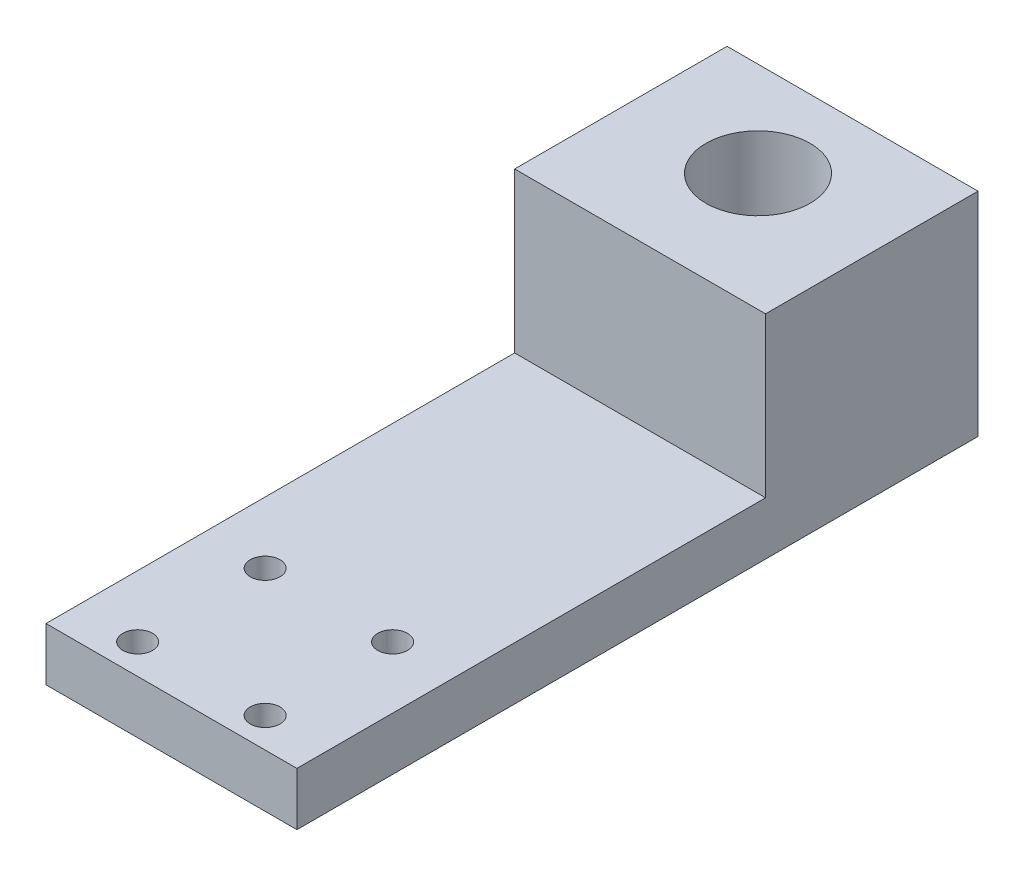
ISO-10303-21;
HEADER;
FILE_DESCRIPTION(('STEP AP214'),'2;1');
FILE_NAME('part.step','',(''),(''),'','','');
FILE_SCHEMA(('AUTOMOTIVE_DESIGN { 1 0 10303 214 1 1 1 1 }'));
ENDSEC;
DATA;
#1=APPLICATION_CONTEXT('core data for automotive mechanical design processes');
#2=APPLICATION_PROTOCOL_DEFINITION('international standard','automotive_design',2000,#1);
#3=PRODUCT_CONTEXT('',#1,'mechanical');
#4=PRODUCT('Part','Part','',(#3));
#5=PRODUCT_RELATED_PRODUCT_CATEGORY('part','',(#4));
#6=PRODUCT_DEFINITION_FORMATION('','',#4);
#7=PRODUCT_DEFINITION_CONTEXT('part definition',#1,'design');
#8=PRODUCT_DEFINITION('design','',#6,#7);
#9=PRODUCT_DEFINITION_SHAPE('','',#8);
#10=(LENGTH_UNIT() NAMED_UNIT(*) SI_UNIT(.MILLI.,.METRE.));
#11=(NAMED_UNIT(*) PLANE_ANGLE_UNIT() SI_UNIT($,.RADIAN.));
#12=(NAMED_UNIT(*) SI_UNIT($,.STERADIAN.) SOLID_ANGLE_UNIT());
#13=UNCERTAINTY_MEASURE_WITH_UNIT(LENGTH_MEASURE(1.E-05),#10,'distance_accuracy_value','');
#14=(GEOMETRIC_REPRESENTATION_CONTEXT(3) GLOBAL_UNCERTAINTY_ASSIGNED_CONTEXT((#13)) GLOBAL_UNIT_ASSIGNED_CONTEXT((#10,
#11,#12)) REPRESENTATION_CONTEXT('',''));
#15=CARTESIAN_POINT('',(0.,0.,0.));
#16=DIRECTION('',(0.,0.,1.));
#17=DIRECTION('',(1.,0.,0.));
#18=AXIS2_PLACEMENT_3D('',#15,#16,#17);
#19=CARTESIAN_POINT('',(0.,3.175,0.));
#20=DIRECTION('',(1.,0.,0.));
#21=DIRECTION('',(0.,0.,-1.));
#22=AXIS2_PLACEMENT_3D('',#19,#20,#21);
#23=PLANE('',#22);
#24=DIRECTION('',(0.,0.,1.));
#25=VECTOR('',#24,1.);
#26=CARTESIAN_POINT('',(0.,0.,0.));
#27=LINE('',#26,#25);
#28=CARTESIAN_POINT('',(0.,0.,0.));
#29=VERTEX_POINT('',#28);
#30=CARTESIAN_POINT('',(0.,0.,40.7162));
#31=VERTEX_POINT('',#30);
#32=EDGE_CURVE('E131',#29,#31,#27,.T.);
#33=ORIENTED_EDGE('',*,*,#32,.T.);
#34=DIRECTION('',(0.,-1.,0.));
#35=VECTOR('',#34,1.);
#36=CARTESIAN_POINT('',(0.,3.175,40.7162));
#37=LINE('',#36,#35);
#38=CARTESIAN_POINT('',(0.,3.175,40.7162));
#39=VERTEX_POINT('',#38);
#40=EDGE_CURVE('E11',#39,#31,#37,.T.);
#41=ORIENTED_EDGE('',*,*,#40,.F.);
#42=DIRECTION('',(0.,0.,1.));
#43=VECTOR('',#42,1.);
#44=CARTESIAN_POINT('',(0.,3.175,0.));
#45=LINE('',#44,#43);
#46=CARTESIAN_POINT('',(0.,3.175,12.7));
#47=VERTEX_POINT('',#46);
#48=EDGE_CURVE('E80',#47,#39,#45,.T.);
#49=ORIENTED_EDGE('',*,*,#48,.F.);
#50=DIRECTION('',(0.,-1.,0.));
#51=VECTOR('',#50,1.);
#52=CARTESIAN_POINT('',(0.,12.7,12.7));
#53=LINE('',#52,#51);
#54=CARTESIAN_POINT('',(0.,12.7,12.7));
#55=VERTEX_POINT('',#54);
#56=EDGE_CURVE('E85',#55,#47,#53,.T.);
#57=ORIENTED_EDGE('',*,*,#56,.F.);
#58=DIRECTION('',(0.,0.,1.));
#59=VECTOR('',#58,1.);
#60=CARTESIAN_POINT('',(0.,12.7,0.));
#61=LINE('',#60,#59);
#62=CARTESIAN_POINT('',(0.,12.7,0.));
#63=VERTEX_POINT('',#62);
#64=EDGE_CURVE('E153',#63,#55,#61,.T.);
#65=ORIENTED_EDGE('',*,*,#64,.F.);
#66=DIRECTION('',(0.,-1.,0.));
#67=VECTOR('',#66,1.);
#68=CARTESIAN_POINT('',(0.,12.7,0.));
#69=LINE('',#68,#67);
#70=EDGE_CURVE('E159',#63,#29,#69,.T.);
#71=ORIENTED_EDGE('',*,*,#70,.T.);
#72=EDGE_LOOP('',(#33,#41,#49,#57,#65,#71));
#73=FACE_BOUND('',#72,.T.);
#74=ADVANCED_FACE('F33',(#73),#23,.F.);
#75=CARTESIAN_POINT('',(0.,3.175,40.7162));
#76=DIRECTION('',(0.,0.,-1.));
#77=DIRECTION('',(-1.,0.,0.));
#78=AXIS2_PLACEMENT_3D('',#75,#76,#77);
#79=PLANE('',#78);
#80=DIRECTION('',(1.,0.,0.));
#81=VECTOR('',#80,1.);
#82=CARTESIAN_POINT('',(0.,0.,40.7162));
#83=LINE('',#82,#81);
#84=CARTESIAN_POINT('',(15.,0.,40.7162));
#85=VERTEX_POINT('',#84);
#86=EDGE_CURVE('E62',#31,#85,#83,.T.);
#87=ORIENTED_EDGE('',*,*,#86,.T.);
#88=DIRECTION('',(0.,-1.,0.));
#89=VECTOR('',#88,1.);
#90=CARTESIAN_POINT('',(15.,3.175,40.7162));
#91=LINE('',#90,#89);
#92=CARTESIAN_POINT('',(15.,3.175,40.7162));
#93=VERTEX_POINT('',#92);
#94=EDGE_CURVE('E42',#93,#85,#91,.T.);
#95=ORIENTED_EDGE('',*,*,#94,.F.);
#96=DIRECTION('',(1.,0.,0.));
#97=VECTOR('',#96,1.);
#98=CARTESIAN_POINT('',(0.,3.175,40.7162));
#99=LINE('',#98,#97);
#100=EDGE_CURVE('E50',#39,#93,#99,.T.);
#101=ORIENTED_EDGE('',*,*,#100,.F.);
#102=ORIENTED_EDGE('',*,*,#40,.T.);
#103=EDGE_LOOP('',(#87,#95,#101,#102));
#104=FACE_BOUND('',#103,.T.);
#105=ADVANCED_FACE('F141',(#104),#79,.F.);
#106=CARTESIAN_POINT('',(3.69,3.175,31.3062));
#107=DIRECTION('',(0.,-1.,0.));
#108=DIRECTION('',(0.,0.,-1.));
#109=AXIS2_PLACEMENT_3D('',#106,#107,#108);
#110=CYLINDRICAL_SURFACE('',#109,0.889);
#111=CARTESIAN_POINT('',(3.69,3.175,31.3062));
#112=DIRECTION('',(0.,1.,0.));
#113=DIRECTION('',(0.,0.,1.));
#114=AXIS2_PLACEMENT_3D('',#111,#112,#113);
#115=CIRCLE('',#114,0.889);
#116=CARTESIAN_POINT('',(3.69,3.175,32.1952));
#117=VERTEX_POINT('',#116);
#118=EDGE_CURVE('E92',#117,#117,#115,.T.);
#119=ORIENTED_EDGE('',*,*,#118,.T.);
#120=EDGE_LOOP('',(#119));
#121=FACE_BOUND('',#120,.T.);
#122=CARTESIAN_POINT('',(3.69,0.,31.3062));
#123=DIRECTION('',(0.,1.,0.));
#124=DIRECTION('',(0.,0.,1.));
#125=AXIS2_PLACEMENT_3D('',#122,#123,#124);
#126=CIRCLE('',#125,0.889);
#127=CARTESIAN_POINT('',(3.69,0.,32.1952));
#128=VERTEX_POINT('',#127);
#129=EDGE_CURVE('E128',#128,#128,#126,.T.);
#130=ORIENTED_EDGE('',*,*,#129,.F.);
#131=EDGE_LOOP('',(#130));
#132=FACE_BOUND('',#131,.T.);
#133=ADVANCED_FACE('F190',(#121,#132),#110,.F.);
#134=CARTESIAN_POINT('',(11.31,3.175,38.9262));
#135=DIRECTION('',(0.,-1.,0.));
#136=DIRECTION('',(0.,0.,-1.));
#137=AXIS2_PLACEMENT_3D('',#134,#135,#136);
#138=CYLINDRICAL_SURFACE('',#137,0.889000000000001);
#139=CARTESIAN_POINT('',(11.31,3.175,38.9262));
#140=DIRECTION('',(0.,1.,0.));
#141=DIRECTION('',(0.,0.,1.));
#142=AXIS2_PLACEMENT_3D('',#139,#140,#141);
#143=CIRCLE('',#142,0.889000000000001);
#144=CARTESIAN_POINT('',(11.31,3.175,39.8152));
#145=VERTEX_POINT('',#144);
#146=EDGE_CURVE('E116',#145,#145,#143,.T.);
#147=ORIENTED_EDGE('',*,*,#146,.T.);
#148=EDGE_LOOP('',(#147));
#149=FACE_BOUND('',#148,.T.);
#150=CARTESIAN_POINT('',(11.31,0.,38.9262));
#151=DIRECTION('',(0.,1.,0.));
#152=DIRECTION('',(0.,0.,1.));
#153=AXIS2_PLACEMENT_3D('',#150,#151,#152);
#154=CIRCLE('',#153,0.889000000000001);
#155=CARTESIAN_POINT('',(11.31,0.,39.8152));
#156=VERTEX_POINT('',#155);
#157=EDGE_CURVE('E125',#156,#156,#154,.T.);
#158=ORIENTED_EDGE('',*,*,#157,.F.);
#159=EDGE_LOOP('',(#158));
#160=FACE_BOUND('',#159,.T.);
#161=ADVANCED_FACE('F196',(#149,#160),#138,.F.);
#162=CARTESIAN_POINT('',(3.69,3.175,38.9262));
#163=DIRECTION('',(0.,-1.,0.));
#164=DIRECTION('',(0.,0.,-1.));
#165=AXIS2_PLACEMENT_3D('',#162,#163,#164);
#166=CYLINDRICAL_SURFACE('',#165,0.888999999999997);
#167=CARTESIAN_POINT('',(3.69,3.175,38.9262));
#168=DIRECTION('',(0.,1.,0.));
#169=DIRECTION('',(0.,0.,1.));
#170=AXIS2_PLACEMENT_3D('',#167,#168,#169);
#171=CIRCLE('',#170,0.888999999999997);
#172=CARTESIAN_POINT('',(3.69,3.175,39.8152));
#173=VERTEX_POINT('',#172);
#174=EDGE_CURVE('E112',#173,#173,#171,.T.);
#175=ORIENTED_EDGE('',*,*,#174,.T.);
#176=EDGE_LOOP('',(#175));
#177=FACE_BOUND('',#176,.T.);
#178=CARTESIAN_POINT('',(3.69,0.,38.9262));
#179=DIRECTION('',(0.,1.,0.));
#180=DIRECTION('',(0.,0.,1.));
#181=AXIS2_PLACEMENT_3D('',#178,#179,#180);
#182=CIRCLE('',#181,0.888999999999997);
#183=CARTESIAN_POINT('',(3.69,0.,39.8152));
#184=VERTEX_POINT('',#183);
#185=EDGE_CURVE('E103',#184,#184,#182,.T.);
#186=ORIENTED_EDGE('',*,*,#185,.F.);
#187=EDGE_LOOP('',(#186));
#188=FACE_BOUND('',#187,.T.);
#189=ADVANCED_FACE('F199',(#177,#188),#166,.F.);
#190=CARTESIAN_POINT('',(11.31,3.175,31.3062));
#191=DIRECTION('',(0.,-1.,0.));
#192=DIRECTION('',(0.,0.,-1.));
#193=AXIS2_PLACEMENT_3D('',#190,#191,#192);
#194=CYLINDRICAL_SURFACE('',#193,0.889000000000003);
#195=CARTESIAN_POINT('',(11.31,3.175,31.3062));
#196=DIRECTION('',(0.,1.,0.));
#197=DIRECTION('',(0.,0.,1.));
#198=AXIS2_PLACEMENT_3D('',#195,#196,#197);
#199=CIRCLE('',#198,0.889000000000003);
#200=CARTESIAN_POINT('',(11.31,3.175,32.1952));
#201=VERTEX_POINT('',#200);
#202=EDGE_CURVE('E109',#201,#201,#199,.T.);
#203=ORIENTED_EDGE('',*,*,#202,.T.);
#204=EDGE_LOOP('',(#203));
#205=FACE_BOUND('',#204,.T.);
#206=CARTESIAN_POINT('',(11.31,0.,31.3062));
#207=DIRECTION('',(0.,1.,0.));
#208=DIRECTION('',(0.,0.,1.));
#209=AXIS2_PLACEMENT_3D('',#206,#207,#208);
#210=CIRCLE('',#209,0.889000000000003);
#211=CARTESIAN_POINT('',(11.31,0.,32.1952));
#212=VERTEX_POINT('',#211);
#213=EDGE_CURVE('E99',#212,#212,#210,.T.);
#214=ORIENTED_EDGE('',*,*,#213,.F.);
#215=EDGE_LOOP('',(#214));
#216=FACE_BOUND('',#215,.T.);
#217=ADVANCED_FACE('F35',(#205,#216),#194,.F.);
#218=CARTESIAN_POINT('',(15.,3.175,0.));
#219=DIRECTION('',(1.,0.,0.));
#220=DIRECTION('',(0.,0.,-1.));
#221=AXIS2_PLACEMENT_3D('',#218,#219,#220);
#222=PLANE('',#221);
#223=DIRECTION('',(0.,0.,1.));
#224=VECTOR('',#223,1.);
#225=CARTESIAN_POINT('',(15.,0.,0.));
#226=LINE('',#225,#224);
#227=CARTESIAN_POINT('',(15.,0.,0.));
#228=VERTEX_POINT('',#227);
#229=EDGE_CURVE('E113',#228,#85,#226,.T.);
#230=ORIENTED_EDGE('',*,*,#229,.F.);
#231=DIRECTION('',(0.,-1.,0.));
#232=VECTOR('',#231,1.);
#233=CARTESIAN_POINT('',(15.,12.7,0.));
#234=LINE('',#233,#232);
#235=CARTESIAN_POINT('',(15.,12.7,0.));
#236=VERTEX_POINT('',#235);
#237=EDGE_CURVE('E105',#236,#228,#234,.T.);
#238=ORIENTED_EDGE('',*,*,#237,.F.);
#239=DIRECTION('',(0.,0.,1.));
#240=VECTOR('',#239,1.);
#241=CARTESIAN_POINT('',(15.,12.7,0.));
#242=LINE('',#241,#240);
#243=CARTESIAN_POINT('',(15.,12.7,12.7));
#244=VERTEX_POINT('',#243);
#245=EDGE_CURVE('E167',#236,#244,#242,.T.);
#246=ORIENTED_EDGE('',*,*,#245,.T.);
#247=DIRECTION('',(0.,-1.,0.));
#248=VECTOR('',#247,1.);
#249=CARTESIAN_POINT('',(15.,12.7,12.7));
#250=LINE('',#249,#248);
#251=CARTESIAN_POINT('',(15.,3.175,12.7));
#252=VERTEX_POINT('',#251);
#253=EDGE_CURVE('E100',#244,#252,#250,.T.);
#254=ORIENTED_EDGE('',*,*,#253,.T.);
#255=DIRECTION('',(0.,0.,1.));
#256=VECTOR('',#255,1.);
#257=CARTESIAN_POINT('',(15.,3.175,0.));
#258=LINE('',#257,#256);
#259=EDGE_CURVE('E68',#252,#93,#258,.T.);
#260=ORIENTED_EDGE('',*,*,#259,.T.);
#261=ORIENTED_EDGE('',*,*,#94,.T.);
#262=EDGE_LOOP('',(#230,#238,#246,#254,#260,#261));
#263=FACE_BOUND('',#262,.T.);
#264=ADVANCED_FACE('F136',(#263),#222,.T.);
#265=CARTESIAN_POINT('',(0.,3.175,0.));
#266=DIRECTION('',(0.,1.,0.));
#267=DIRECTION('',(0.,0.,1.));
#268=AXIS2_PLACEMENT_3D('',#265,#266,#267);
#269=PLANE('',#268);
#270=ORIENTED_EDGE('',*,*,#202,.F.);
#271=EDGE_LOOP('',(#270));
#272=FACE_BOUND('',#271,.T.);
#273=ORIENTED_EDGE('',*,*,#174,.F.);
#274=EDGE_LOOP('',(#273));
#275=FACE_BOUND('',#274,.T.);
#276=ORIENTED_EDGE('',*,*,#146,.F.);
#277=EDGE_LOOP('',(#276));
#278=FACE_BOUND('',#277,.T.);
#279=ORIENTED_EDGE('',*,*,#118,.F.);
#280=EDGE_LOOP('',(#279));
#281=FACE_BOUND('',#280,.T.);
#282=DIRECTION('',(1.,0.,0.));
#283=VECTOR('',#282,1.);
#284=CARTESIAN_POINT('',(0.,3.175,12.7));
#285=LINE('',#284,#283);
#286=EDGE_CURVE('E86',#47,#252,#285,.T.);
#287=ORIENTED_EDGE('',*,*,#286,.F.);
#288=ORIENTED_EDGE('',*,*,#48,.T.);
#289=ORIENTED_EDGE('',*,*,#100,.T.);
#290=ORIENTED_EDGE('',*,*,#259,.F.);
#291=EDGE_LOOP('',(#287,#288,#289,#290));
#292=FACE_BOUND('',#291,.T.);
#293=ADVANCED_FACE('F88',(#272,#275,#278,#281,#292),#269,.T.);
#294=CARTESIAN_POINT('',(0.,0.,0.));
#295=DIRECTION('',(0.,1.,0.));
#296=DIRECTION('',(0.,0.,1.));
#297=AXIS2_PLACEMENT_3D('',#294,#295,#296);
#298=PLANE('',#297);
#299=ORIENTED_EDGE('',*,*,#213,.T.);
#300=EDGE_LOOP('',(#299));
#301=FACE_BOUND('',#300,.T.);
#302=ORIENTED_EDGE('',*,*,#185,.T.);
#303=EDGE_LOOP('',(#302));
#304=FACE_BOUND('',#303,.T.);
#305=ORIENTED_EDGE('',*,*,#157,.T.);
#306=EDGE_LOOP('',(#305));
#307=FACE_BOUND('',#306,.T.);
#308=ORIENTED_EDGE('',*,*,#129,.T.);
#309=EDGE_LOOP('',(#308));
#310=FACE_BOUND('',#309,.T.);
#311=ORIENTED_EDGE('',*,*,#32,.F.);
#312=DIRECTION('',(1.,0.,0.));
#313=VECTOR('',#312,1.);
#314=CARTESIAN_POINT('',(0.,0.,0.));
#315=LINE('',#314,#313);
#316=EDGE_CURVE('E146',#29,#228,#315,.T.);
#317=ORIENTED_EDGE('',*,*,#316,.T.);
#318=ORIENTED_EDGE('',*,*,#229,.T.);
#319=ORIENTED_EDGE('',*,*,#86,.F.);
#320=EDGE_LOOP('',(#311,#317,#318,#319));
#321=FACE_BOUND('',#320,.T.);
#322=CARTESIAN_POINT('',(7.5,0.,5.6515));
#323=DIRECTION('',(0.,1.,0.));
#324=DIRECTION('',(0.,0.,1.));
#325=AXIS2_PLACEMENT_3D('',#322,#323,#324);
#326=CIRCLE('',#325,3.1115);
#327=CARTESIAN_POINT('',(7.5,0.,8.763));
#328=VERTEX_POINT('',#327);
#329=EDGE_CURVE('E150',#328,#328,#326,.T.);
#330=ORIENTED_EDGE('',*,*,#329,.T.);
#331=EDGE_LOOP('',(#330));
#332=FACE_BOUND('',#331,.T.);
#333=ADVANCED_FACE('F143',(#301,#304,#307,#310,#321,#332),#298,.F.);
#334=CARTESIAN_POINT('',(0.,12.7,12.7));
#335=DIRECTION('',(0.,0.,-1.));
#336=DIRECTION('',(-1.,0.,0.));
#337=AXIS2_PLACEMENT_3D('',#334,#335,#336);
#338=PLANE('',#337);
#339=ORIENTED_EDGE('',*,*,#56,.T.);
#340=ORIENTED_EDGE('',*,*,#286,.T.);
#341=ORIENTED_EDGE('',*,*,#253,.F.);
#342=DIRECTION('',(1.,0.,0.));
#343=VECTOR('',#342,1.);
#344=CARTESIAN_POINT('',(0.,12.7,12.7));
#345=LINE('',#344,#343);
#346=EDGE_CURVE('E97',#55,#244,#345,.T.);
#347=ORIENTED_EDGE('',*,*,#346,.F.);
#348=EDGE_LOOP('',(#339,#340,#341,#347));
#349=FACE_BOUND('',#348,.T.);
#350=ADVANCED_FACE('F95',(#349),#338,.F.);
#351=CARTESIAN_POINT('',(7.5,12.7,5.6515));
#352=DIRECTION('',(0.,-1.,0.));
#353=DIRECTION('',(0.,0.,-1.));
#354=AXIS2_PLACEMENT_3D('',#351,#352,#353);
#355=CYLINDRICAL_SURFACE('',#354,3.1115);
#356=CARTESIAN_POINT('',(7.5,12.7,5.6515));
#357=DIRECTION('',(0.,1.,0.));
#358=DIRECTION('',(0.,0.,1.));
#359=AXIS2_PLACEMENT_3D('',#356,#357,#358);
#360=CIRCLE('',#359,3.1115);
#361=CARTESIAN_POINT('',(7.5,12.7,8.763));
#362=VERTEX_POINT('',#361);
#363=EDGE_CURVE('E149',#362,#362,#360,.T.);
#364=ORIENTED_EDGE('',*,*,#363,.T.);
#365=EDGE_LOOP('',(#364));
#366=FACE_BOUND('',#365,.T.);
#367=ORIENTED_EDGE('',*,*,#329,.F.);
#368=EDGE_LOOP('',(#367));
#369=FACE_BOUND('',#368,.T.);
#370=ADVANCED_FACE('F182',(#366,#369),#355,.F.);
#371=CARTESIAN_POINT('',(0.,12.7,0.));
#372=DIRECTION('',(0.,0.,-1.));
#373=DIRECTION('',(-1.,0.,0.));
#374=AXIS2_PLACEMENT_3D('',#371,#372,#373);
#375=PLANE('',#374);
#376=ORIENTED_EDGE('',*,*,#316,.F.);
#377=ORIENTED_EDGE('',*,*,#70,.F.);
#378=DIRECTION('',(1.,0.,0.));
#379=VECTOR('',#378,1.);
#380=CARTESIAN_POINT('',(0.,12.7,0.));
#381=LINE('',#380,#379);
#382=EDGE_CURVE('E160',#63,#236,#381,.T.);
#383=ORIENTED_EDGE('',*,*,#382,.T.);
#384=ORIENTED_EDGE('',*,*,#237,.T.);
#385=EDGE_LOOP('',(#376,#377,#383,#384));
#386=FACE_BOUND('',#385,.T.);
#387=ADVANCED_FACE('F162',(#386),#375,.T.);
#388=CARTESIAN_POINT('',(0.,12.7,0.));
#389=DIRECTION('',(0.,1.,0.));
#390=DIRECTION('',(0.,0.,1.));
#391=AXIS2_PLACEMENT_3D('',#388,#389,#390);
#392=PLANE('',#391);
#393=ORIENTED_EDGE('',*,*,#363,.F.);
#394=EDGE_LOOP('',(#393));
#395=FACE_BOUND('',#394,.T.);
#396=ORIENTED_EDGE('',*,*,#64,.T.);
#397=ORIENTED_EDGE('',*,*,#346,.T.);
#398=ORIENTED_EDGE('',*,*,#245,.F.);
#399=ORIENTED_EDGE('',*,*,#382,.F.);
#400=EDGE_LOOP('',(#396,#397,#398,#399));
#401=FACE_BOUND('',#400,.T.);
#402=ADVANCED_FACE('F170',(#395,#401),#392,.T.);
#403=CLOSED_SHELL('',(#74,#105,#133,#161,#189,#217,#264,#293,#333,#350,#370,#387,#402));
#404=MANIFOLD_SOLID_BREP('B2',#403);
#405=ADVANCED_BREP_SHAPE_REPRESENTATION('',(#18,#404),#14);
#406=SHAPE_DEFINITION_REPRESENTATION(#9,#405);
ENDSEC;
END-ISO-10303-21;
